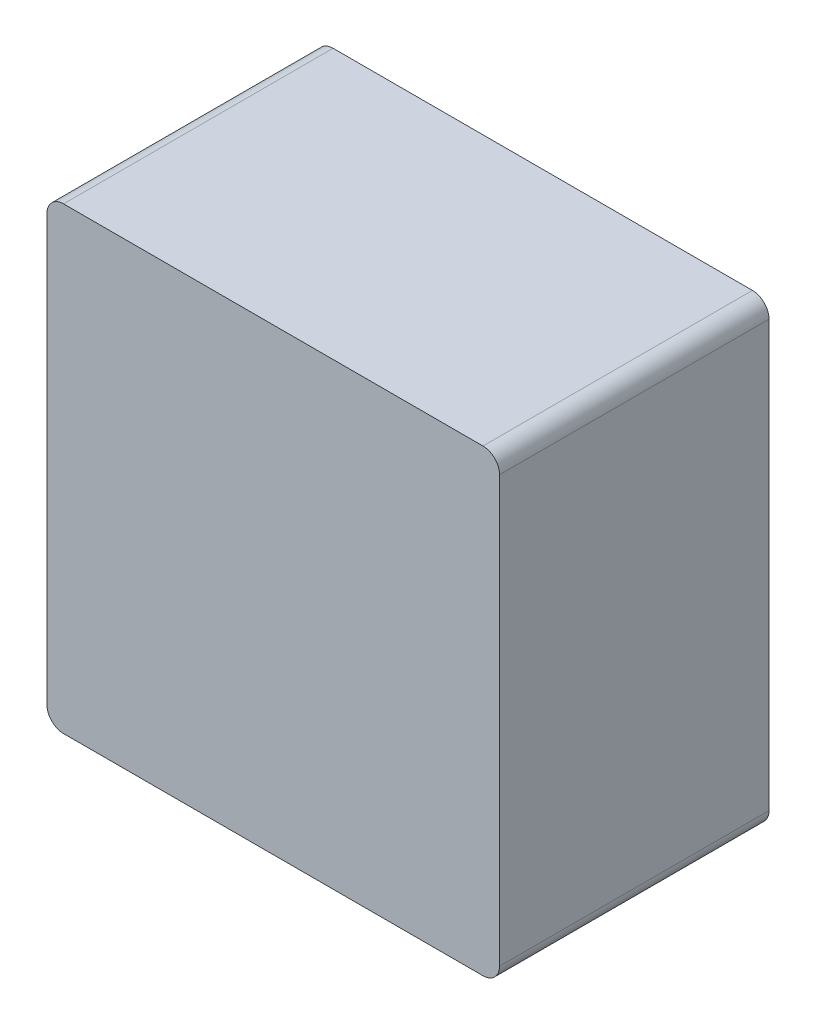
ISO-10303-21;
HEADER;
FILE_DESCRIPTION(('STEP AP214'),'2;1');
FILE_NAME('part.step','',(''),(''),'','','');
FILE_SCHEMA(('AUTOMOTIVE_DESIGN { 1 0 10303 214 1 1 1 1 }'));
ENDSEC;
DATA;
#1=APPLICATION_CONTEXT('core data for automotive mechanical design processes');
#2=APPLICATION_PROTOCOL_DEFINITION('international standard','automotive_design',2000,#1);
#3=PRODUCT_CONTEXT('',#1,'mechanical');
#4=PRODUCT('Part','Part','',(#3));
#5=PRODUCT_RELATED_PRODUCT_CATEGORY('part','',(#4));
#6=PRODUCT_DEFINITION_FORMATION('','',#4);
#7=PRODUCT_DEFINITION_CONTEXT('part definition',#1,'design');
#8=PRODUCT_DEFINITION('design','',#6,#7);
#9=PRODUCT_DEFINITION_SHAPE('','',#8);
#10=(LENGTH_UNIT() NAMED_UNIT(*) SI_UNIT(.MILLI.,.METRE.));
#11=(NAMED_UNIT(*) PLANE_ANGLE_UNIT() SI_UNIT($,.RADIAN.));
#12=(NAMED_UNIT(*) SI_UNIT($,.STERADIAN.) SOLID_ANGLE_UNIT());
#13=UNCERTAINTY_MEASURE_WITH_UNIT(LENGTH_MEASURE(1.E-05),#10,'distance_accuracy_value','');
#14=(GEOMETRIC_REPRESENTATION_CONTEXT(3) GLOBAL_UNCERTAINTY_ASSIGNED_CONTEXT((#13)) GLOBAL_UNIT_ASSIGNED_CONTEXT((#10,
#11,#12)) REPRESENTATION_CONTEXT('',''));
#15=CARTESIAN_POINT('',(0.,0.,0.));
#16=DIRECTION('',(0.,0.,1.));
#17=DIRECTION('',(1.,0.,0.));
#18=AXIS2_PLACEMENT_3D('',#15,#16,#17);
#19=CARTESIAN_POINT('',(0.,0.,80.));
#20=DIRECTION('',(0.,0.,1.));
#21=DIRECTION('',(1.,0.,0.));
#22=AXIS2_PLACEMENT_3D('',#19,#20,#21);
#23=PLANE('',#22);
#24=DIRECTION('',(0.,-1.,0.));
#25=VECTOR('',#24,1.);
#26=CARTESIAN_POINT('',(39.0435,38.599,80.));
#27=LINE('',#26,#25);
#28=CARTESIAN_POINT('',(39.0435,38.599,80.));
#29=VERTEX_POINT('',#28);
#30=CARTESIAN_POINT('',(39.0435,-38.599,80.));
#31=VERTEX_POINT('',#30);
#32=EDGE_CURVE('E179',#29,#31,#27,.T.);
#33=ORIENTED_EDGE('',*,*,#32,.F.);
#34=DIRECTION('',(1.,0.,0.));
#35=VECTOR('',#34,1.);
#36=CARTESIAN_POINT('',(-39.0435,38.599,80.));
#37=LINE('',#36,#35);
#38=CARTESIAN_POINT('',(-39.0435,38.599,80.));
#39=VERTEX_POINT('',#38);
#40=EDGE_CURVE('E53',#39,#29,#37,.T.);
#41=ORIENTED_EDGE('',*,*,#40,.F.);
#42=DIRECTION('',(0.,1.,0.));
#43=VECTOR('',#42,1.);
#44=CARTESIAN_POINT('',(-39.0435,-38.599,80.));
#45=LINE('',#44,#43);
#46=CARTESIAN_POINT('',(-39.0435,-38.599,80.));
#47=VERTEX_POINT('',#46);
#48=EDGE_CURVE('E170',#47,#39,#45,.T.);
#49=ORIENTED_EDGE('',*,*,#48,.F.);
#50=DIRECTION('',(-1.,0.,0.));
#51=VECTOR('',#50,1.);
#52=CARTESIAN_POINT('',(39.0435,-38.599,80.));
#53=LINE('',#52,#51);
#54=EDGE_CURVE('E173',#31,#47,#53,.T.);
#55=ORIENTED_EDGE('',*,*,#54,.F.);
#56=EDGE_LOOP('',(#33,#41,#49,#55));
#57=FACE_BOUND('',#56,.T.);
#58=CARTESIAN_POINT('',(-37.8935,37.449,80.));
#59=DIRECTION('',(0.,0.,1.));
#60=DIRECTION('',(1.,0.,0.));
#61=AXIS2_PLACEMENT_3D('',#58,#59,#60);
#62=CIRCLE('',#61,3.);
#63=CARTESIAN_POINT('',(-40.8935,37.449,80.));
#64=VERTEX_POINT('',#63);
#65=CARTESIAN_POINT('',(-37.8935,40.449,80.));
#66=VERTEX_POINT('',#65);
#67=EDGE_CURVE('E278',#64,#66,#62,.F.);
#68=ORIENTED_EDGE('',*,*,#67,.T.);
#69=DIRECTION('',(-1.,0.,0.));
#70=VECTOR('',#69,1.);
#71=CARTESIAN_POINT('',(-36.8935,40.449,80.));
#72=LINE('',#71,#70);
#73=CARTESIAN_POINT('',(37.8935,40.449,80.));
#74=VERTEX_POINT('',#73);
#75=EDGE_CURVE('E279',#74,#66,#72,.T.);
#76=ORIENTED_EDGE('',*,*,#75,.F.);
#77=CARTESIAN_POINT('',(37.8935,37.449,80.));
#78=DIRECTION('',(0.,0.,1.));
#79=DIRECTION('',(1.,0.,0.));
#80=AXIS2_PLACEMENT_3D('',#77,#78,#79);
#81=CIRCLE('',#80,3.);
#82=CARTESIAN_POINT('',(40.8935,37.449,80.));
#83=VERTEX_POINT('',#82);
#84=EDGE_CURVE('E274',#74,#83,#81,.F.);
#85=ORIENTED_EDGE('',*,*,#84,.T.);
#86=DIRECTION('',(0.,1.,0.));
#87=VECTOR('',#86,1.);
#88=CARTESIAN_POINT('',(40.8935,36.449,80.));
#89=LINE('',#88,#87);
#90=CARTESIAN_POINT('',(40.8935,-39.449,80.));
#91=VERTEX_POINT('',#90);
#92=EDGE_CURVE('E271',#91,#83,#89,.T.);
#93=ORIENTED_EDGE('',*,*,#92,.F.);
#94=CARTESIAN_POINT('',(37.8935,-39.449,80.));
#95=DIRECTION('',(0.,0.,1.));
#96=DIRECTION('',(1.,0.,0.));
#97=AXIS2_PLACEMENT_3D('',#94,#95,#96);
#98=CIRCLE('',#97,3.);
#99=CARTESIAN_POINT('',(37.8935,-42.449,80.));
#100=VERTEX_POINT('',#99);
#101=EDGE_CURVE('E46',#91,#100,#98,.F.);
#102=ORIENTED_EDGE('',*,*,#101,.T.);
#103=DIRECTION('',(-1.,0.,0.));
#104=VECTOR('',#103,1.);
#105=CARTESIAN_POINT('',(0.,-42.449,80.));
#106=LINE('',#105,#104);
#107=CARTESIAN_POINT('',(-37.8935,-42.449,80.));
#108=VERTEX_POINT('',#107);
#109=EDGE_CURVE('E275',#100,#108,#106,.T.);
#110=ORIENTED_EDGE('',*,*,#109,.T.);
#111=CARTESIAN_POINT('',(-37.8935,-39.449,80.));
#112=DIRECTION('',(0.,0.,1.));
#113=DIRECTION('',(1.,0.,0.));
#114=AXIS2_PLACEMENT_3D('',#111,#112,#113);
#115=CIRCLE('',#114,3.);
#116=CARTESIAN_POINT('',(-40.8935,-39.449,80.));
#117=VERTEX_POINT('',#116);
#118=EDGE_CURVE('E284',#108,#117,#115,.F.);
#119=ORIENTED_EDGE('',*,*,#118,.T.);
#120=DIRECTION('',(0.,-1.,0.));
#121=VECTOR('',#120,1.);
#122=CARTESIAN_POINT('',(-40.8935,36.449,80.));
#123=LINE('',#122,#121);
#124=EDGE_CURVE('E281',#64,#117,#123,.T.);
#125=ORIENTED_EDGE('',*,*,#124,.F.);
#126=EDGE_LOOP('',(#68,#76,#85,#93,#102,#110,#119,#125));
#127=FACE_BOUND('',#126,.T.);
#128=ADVANCED_FACE('F39',(#57,#127),#23,.F.);
#129=CARTESIAN_POINT('',(-36.8935,40.449,123.698));
#130=DIRECTION('',(0.,-1.,0.));
#131=DIRECTION('',(0.,0.,-1.));
#132=AXIS2_PLACEMENT_3D('',#129,#130,#131);
#133=PLANE('',#132);
#134=DIRECTION('',(0.,0.,-1.));
#135=VECTOR('',#134,1.);
#136=CARTESIAN_POINT('',(37.8935,40.449,123.698));
#137=LINE('',#136,#135);
#138=CARTESIAN_POINT('',(37.8935,40.449,128.698));
#139=VERTEX_POINT('',#138);
#140=EDGE_CURVE('E248',#139,#74,#137,.T.);
#141=ORIENTED_EDGE('',*,*,#140,.T.);
#142=ORIENTED_EDGE('',*,*,#75,.T.);
#143=DIRECTION('',(0.,0.,-1.));
#144=VECTOR('',#143,1.);
#145=CARTESIAN_POINT('',(-37.8935,40.449,123.698));
#146=LINE('',#145,#144);
#147=CARTESIAN_POINT('',(-37.8935,40.449,128.698));
#148=VERTEX_POINT('',#147);
#149=EDGE_CURVE('E251',#66,#148,#146,.F.);
#150=ORIENTED_EDGE('',*,*,#149,.T.);
#151=DIRECTION('',(-1.,0.,0.));
#152=VECTOR('',#151,1.);
#153=CARTESIAN_POINT('',(40.8935,40.449,128.698));
#154=LINE('',#153,#152);
#155=EDGE_CURVE('E213',#139,#148,#154,.T.);
#156=ORIENTED_EDGE('',*,*,#155,.F.);
#157=EDGE_LOOP('',(#141,#142,#150,#156));
#158=FACE_BOUND('',#157,.T.);
#159=ADVANCED_FACE('F299',(#158),#133,.F.);
#160=CARTESIAN_POINT('',(-40.8935,36.449,123.698));
#161=DIRECTION('',(1.,0.,0.));
#162=DIRECTION('',(0.,1.,0.));
#163=AXIS2_PLACEMENT_3D('',#160,#161,#162);
#164=PLANE('',#163);
#165=DIRECTION('',(0.,0.,-1.));
#166=VECTOR('',#165,1.);
#167=CARTESIAN_POINT('',(-40.8935,37.449,123.698));
#168=LINE('',#167,#166);
#169=CARTESIAN_POINT('',(-40.8935,37.449,128.698));
#170=VERTEX_POINT('',#169);
#171=EDGE_CURVE('E245',#170,#64,#168,.T.);
#172=ORIENTED_EDGE('',*,*,#171,.T.);
#173=ORIENTED_EDGE('',*,*,#124,.T.);
#174=DIRECTION('',(0.,0.,-1.));
#175=VECTOR('',#174,1.);
#176=CARTESIAN_POINT('',(-40.8935,-39.449,128.698));
#177=LINE('',#176,#175);
#178=CARTESIAN_POINT('',(-40.8935,-39.449,128.698));
#179=VERTEX_POINT('',#178);
#180=EDGE_CURVE('E243',#117,#179,#177,.F.);
#181=ORIENTED_EDGE('',*,*,#180,.T.);
#182=DIRECTION('',(0.,-1.,0.));
#183=VECTOR('',#182,1.);
#184=CARTESIAN_POINT('',(-40.8935,40.449,128.698));
#185=LINE('',#184,#183);
#186=EDGE_CURVE('E216',#170,#179,#185,.T.);
#187=ORIENTED_EDGE('',*,*,#186,.F.);
#188=EDGE_LOOP('',(#172,#173,#181,#187));
#189=FACE_BOUND('',#188,.T.);
#190=ADVANCED_FACE('F327',(#189),#164,.F.);
#191=CARTESIAN_POINT('',(40.8935,36.449,123.698));
#192=DIRECTION('',(-1.,0.,0.));
#193=DIRECTION('',(0.,0.,1.));
#194=AXIS2_PLACEMENT_3D('',#191,#192,#193);
#195=PLANE('',#194);
#196=DIRECTION('',(0.,0.,1.));
#197=VECTOR('',#196,1.);
#198=CARTESIAN_POINT('',(40.8935,-39.449,-4.));
#199=LINE('',#198,#197);
#200=CARTESIAN_POINT('',(40.8935,-39.449,128.698));
#201=VERTEX_POINT('',#200);
#202=EDGE_CURVE('E266',#201,#91,#199,.F.);
#203=ORIENTED_EDGE('',*,*,#202,.T.);
#204=ORIENTED_EDGE('',*,*,#92,.T.);
#205=DIRECTION('',(0.,0.,-1.));
#206=VECTOR('',#205,1.);
#207=CARTESIAN_POINT('',(40.8935,37.449,123.698));
#208=LINE('',#207,#206);
#209=CARTESIAN_POINT('',(40.8935,37.449,128.698));
#210=VERTEX_POINT('',#209);
#211=EDGE_CURVE('E269',#83,#210,#208,.F.);
#212=ORIENTED_EDGE('',*,*,#211,.T.);
#213=DIRECTION('',(0.,1.,0.));
#214=VECTOR('',#213,1.);
#215=CARTESIAN_POINT('',(40.8935,-40.449,128.698));
#216=LINE('',#215,#214);
#217=EDGE_CURVE('E210',#201,#210,#216,.T.);
#218=ORIENTED_EDGE('',*,*,#217,.F.);
#219=EDGE_LOOP('',(#203,#204,#212,#218));
#220=FACE_BOUND('',#219,.T.);
#221=ADVANCED_FACE('F313',(#220),#195,.F.);
#222=CARTESIAN_POINT('',(0.,0.,128.698));
#223=DIRECTION('',(0.,0.,1.));
#224=DIRECTION('',(1.,0.,0.));
#225=AXIS2_PLACEMENT_3D('',#222,#223,#224);
#226=PLANE('',#225);
#227=ORIENTED_EDGE('',*,*,#155,.T.);
#228=CARTESIAN_POINT('',(-37.8935,37.449,128.698));
#229=DIRECTION('',(0.,0.,1.));
#230=DIRECTION('',(1.,0.,0.));
#231=AXIS2_PLACEMENT_3D('',#228,#229,#230);
#232=CIRCLE('',#231,3.);
#233=EDGE_CURVE('E259',#148,#170,#232,.T.);
#234=ORIENTED_EDGE('',*,*,#233,.T.);
#235=ORIENTED_EDGE('',*,*,#186,.T.);
#236=CARTESIAN_POINT('',(-37.8935,-39.449,128.698));
#237=DIRECTION('',(0.,0.,1.));
#238=DIRECTION('',(1.,0.,0.));
#239=AXIS2_PLACEMENT_3D('',#236,#237,#238);
#240=CIRCLE('',#239,3.);
#241=CARTESIAN_POINT('',(-37.8935,-42.449,128.698));
#242=VERTEX_POINT('',#241);
#243=EDGE_CURVE('E257',#179,#242,#240,.T.);
#244=ORIENTED_EDGE('',*,*,#243,.T.);
#245=DIRECTION('',(-1.,0.,0.));
#246=VECTOR('',#245,1.);
#247=CARTESIAN_POINT('',(40.8935,-42.449,128.698));
#248=LINE('',#247,#246);
#249=CARTESIAN_POINT('',(37.8935,-42.449,128.698));
#250=VERTEX_POINT('',#249);
#251=EDGE_CURVE('E205',#250,#242,#248,.T.);
#252=ORIENTED_EDGE('',*,*,#251,.F.);
#253=CARTESIAN_POINT('',(37.8935,-39.449,128.698));
#254=DIRECTION('',(0.,0.,1.));
#255=DIRECTION('',(1.,0.,0.));
#256=AXIS2_PLACEMENT_3D('',#253,#254,#255);
#257=CIRCLE('',#256,3.);
#258=EDGE_CURVE('E253',#250,#201,#257,.T.);
#259=ORIENTED_EDGE('',*,*,#258,.T.);
#260=ORIENTED_EDGE('',*,*,#217,.T.);
#261=CARTESIAN_POINT('',(37.8935,37.449,128.698));
#262=DIRECTION('',(0.,0.,1.));
#263=DIRECTION('',(1.,0.,0.));
#264=AXIS2_PLACEMENT_3D('',#261,#262,#263);
#265=CIRCLE('',#264,3.);
#266=EDGE_CURVE('E255',#210,#139,#265,.T.);
#267=ORIENTED_EDGE('',*,*,#266,.T.);
#268=EDGE_LOOP('',(#227,#234,#235,#244,#252,#259,#260,#267));
#269=FACE_BOUND('',#268,.T.);
#270=ADVANCED_FACE('F302',(#269),#226,.T.);
#271=CARTESIAN_POINT('',(0.,-42.449,0.));
#272=DIRECTION('',(0.,-1.,0.));
#273=DIRECTION('',(1.,0.,0.));
#274=AXIS2_PLACEMENT_3D('',#271,#272,#273);
#275=PLANE('',#274);
#276=ORIENTED_EDGE('',*,*,#109,.F.);
#277=DIRECTION('',(0.,0.,1.));
#278=VECTOR('',#277,1.);
#279=CARTESIAN_POINT('',(37.8935,-42.449,128.698));
#280=LINE('',#279,#278);
#281=EDGE_CURVE('E261',#100,#250,#280,.T.);
#282=ORIENTED_EDGE('',*,*,#281,.T.);
#283=ORIENTED_EDGE('',*,*,#251,.T.);
#284=DIRECTION('',(0.,0.,-1.));
#285=VECTOR('',#284,1.);
#286=CARTESIAN_POINT('',(-37.8935,-42.449,-4.));
#287=LINE('',#286,#285);
#288=EDGE_CURVE('E263',#242,#108,#287,.T.);
#289=ORIENTED_EDGE('',*,*,#288,.T.);
#290=EDGE_LOOP('',(#276,#282,#283,#289));
#291=FACE_BOUND('',#290,.T.);
#292=CARTESIAN_POINT('',(22.225,-42.449,109.648));
#293=DIRECTION('',(0.,-1.,0.));
#294=DIRECTION('',(1.,0.,0.));
#295=AXIS2_PLACEMENT_3D('',#292,#293,#294);
#296=CIRCLE('',#295,3.025);
#297=CARTESIAN_POINT('',(25.25,-42.449,109.648));
#298=VERTEX_POINT('',#297);
#299=EDGE_CURVE('E196',#298,#298,#296,.T.);
#300=ORIENTED_EDGE('',*,*,#299,.F.);
#301=EDGE_LOOP('',(#300));
#302=FACE_BOUND('',#301,.T.);
#303=CARTESIAN_POINT('',(-22.225,-42.449,109.648));
#304=DIRECTION('',(0.,-1.,0.));
#305=DIRECTION('',(1.,0.,0.));
#306=AXIS2_PLACEMENT_3D('',#303,#304,#305);
#307=CIRCLE('',#306,3.025);
#308=CARTESIAN_POINT('',(-19.2,-42.449,109.648));
#309=VERTEX_POINT('',#308);
#310=EDGE_CURVE('E199',#309,#309,#307,.T.);
#311=ORIENTED_EDGE('',*,*,#310,.F.);
#312=EDGE_LOOP('',(#311));
#313=FACE_BOUND('',#312,.T.);
#314=ADVANCED_FACE('F319',(#291,#302,#313),#275,.T.);
#315=CARTESIAN_POINT('',(-22.225,-37.449,109.648));
#316=DIRECTION('',(0.,-1.,0.));
#317=DIRECTION('',(1.,0.,0.));
#318=AXIS2_PLACEMENT_3D('',#315,#316,#317);
#319=CYLINDRICAL_SURFACE('',#318,3.025);
#320=CARTESIAN_POINT('',(-22.225,-37.449,109.648));
#321=DIRECTION('',(0.,-1.,0.));
#322=DIRECTION('',(1.,0.,0.));
#323=AXIS2_PLACEMENT_3D('',#320,#321,#322);
#324=CIRCLE('',#323,3.025);
#325=CARTESIAN_POINT('',(-19.2,-37.449,109.648));
#326=VERTEX_POINT('',#325);
#327=EDGE_CURVE('E202',#326,#326,#324,.T.);
#328=ORIENTED_EDGE('',*,*,#327,.F.);
#329=EDGE_LOOP('',(#328));
#330=FACE_BOUND('',#329,.T.);
#331=ORIENTED_EDGE('',*,*,#310,.T.);
#332=EDGE_LOOP('',(#331));
#333=FACE_BOUND('',#332,.T.);
#334=ADVANCED_FACE('F375',(#330,#333),#319,.F.);
#335=CARTESIAN_POINT('',(-22.225,-37.449,109.648));
#336=DIRECTION('',(0.,-1.,0.));
#337=DIRECTION('',(1.,0.,0.));
#338=AXIS2_PLACEMENT_3D('',#335,#336,#337);
#339=PLANE('',#338);
#340=ORIENTED_EDGE('',*,*,#327,.T.);
#341=EDGE_LOOP('',(#340));
#342=FACE_BOUND('',#341,.T.);
#343=ADVANCED_FACE('F369',(#342),#339,.T.);
#344=CARTESIAN_POINT('',(22.225,-37.449,109.648));
#345=DIRECTION('',(0.,-1.,0.));
#346=DIRECTION('',(1.,0.,0.));
#347=AXIS2_PLACEMENT_3D('',#344,#345,#346);
#348=CYLINDRICAL_SURFACE('',#347,3.025);
#349=CARTESIAN_POINT('',(22.225,-37.449,109.648));
#350=DIRECTION('',(0.,-1.,0.));
#351=DIRECTION('',(1.,0.,0.));
#352=AXIS2_PLACEMENT_3D('',#349,#350,#351);
#353=CIRCLE('',#352,3.025);
#354=CARTESIAN_POINT('',(25.25,-37.449,109.648));
#355=VERTEX_POINT('',#354);
#356=EDGE_CURVE('E195',#355,#355,#353,.T.);
#357=ORIENTED_EDGE('',*,*,#356,.F.);
#358=EDGE_LOOP('',(#357));
#359=FACE_BOUND('',#358,.T.);
#360=ORIENTED_EDGE('',*,*,#299,.T.);
#361=EDGE_LOOP('',(#360));
#362=FACE_BOUND('',#361,.T.);
#363=ADVANCED_FACE('F362',(#359,#362),#348,.F.);
#364=CARTESIAN_POINT('',(22.225,-37.449,109.648));
#365=DIRECTION('',(0.,-1.,0.));
#366=DIRECTION('',(1.,0.,0.));
#367=AXIS2_PLACEMENT_3D('',#364,#365,#366);
#368=PLANE('',#367);
#369=ORIENTED_EDGE('',*,*,#356,.T.);
#370=EDGE_LOOP('',(#369));
#371=FACE_BOUND('',#370,.T.);
#372=ADVANCED_FACE('F357',(#371),#368,.T.);
#373=CARTESIAN_POINT('',(-37.8935,37.449,123.698));
#374=DIRECTION('',(0.,0.,-1.));
#375=DIRECTION('',(-1.,0.,0.));
#376=AXIS2_PLACEMENT_3D('',#373,#374,#375);
#377=CYLINDRICAL_SURFACE('',#376,3.);
#378=ORIENTED_EDGE('',*,*,#67,.F.);
#379=ORIENTED_EDGE('',*,*,#171,.F.);
#380=ORIENTED_EDGE('',*,*,#233,.F.);
#381=ORIENTED_EDGE('',*,*,#149,.F.);
#382=EDGE_LOOP('',(#378,#379,#380,#381));
#383=FACE_BOUND('',#382,.T.);
#384=ADVANCED_FACE('F296',(#383),#377,.T.);
#385=CARTESIAN_POINT('',(-37.8935,-39.449,0.));
#386=DIRECTION('',(0.,0.,1.));
#387=DIRECTION('',(1.,0.,0.));
#388=AXIS2_PLACEMENT_3D('',#385,#386,#387);
#389=CYLINDRICAL_SURFACE('',#388,3.);
#390=ORIENTED_EDGE('',*,*,#118,.F.);
#391=ORIENTED_EDGE('',*,*,#288,.F.);
#392=ORIENTED_EDGE('',*,*,#243,.F.);
#393=ORIENTED_EDGE('',*,*,#180,.F.);
#394=EDGE_LOOP('',(#390,#391,#392,#393));
#395=FACE_BOUND('',#394,.T.);
#396=ADVANCED_FACE('F325',(#395),#389,.T.);
#397=CARTESIAN_POINT('',(37.8935,37.449,123.698));
#398=DIRECTION('',(0.,0.,-1.));
#399=DIRECTION('',(-1.,0.,0.));
#400=AXIS2_PLACEMENT_3D('',#397,#398,#399);
#401=CYLINDRICAL_SURFACE('',#400,3.);
#402=ORIENTED_EDGE('',*,*,#84,.F.);
#403=ORIENTED_EDGE('',*,*,#140,.F.);
#404=ORIENTED_EDGE('',*,*,#266,.F.);
#405=ORIENTED_EDGE('',*,*,#211,.F.);
#406=EDGE_LOOP('',(#402,#403,#404,#405));
#407=FACE_BOUND('',#406,.T.);
#408=ADVANCED_FACE('F308',(#407),#401,.T.);
#409=CARTESIAN_POINT('',(37.8935,-39.449,0.));
#410=DIRECTION('',(0.,0.,-1.));
#411=DIRECTION('',(-1.,0.,0.));
#412=AXIS2_PLACEMENT_3D('',#409,#410,#411);
#413=CYLINDRICAL_SURFACE('',#412,3.);
#414=ORIENTED_EDGE('',*,*,#101,.F.);
#415=ORIENTED_EDGE('',*,*,#202,.F.);
#416=ORIENTED_EDGE('',*,*,#258,.F.);
#417=ORIENTED_EDGE('',*,*,#281,.F.);
#418=EDGE_LOOP('',(#414,#415,#416,#417));
#419=FACE_BOUND('',#418,.T.);
#420=ADVANCED_FACE('F316',(#419),#413,.T.);
#421=CARTESIAN_POINT('',(-39.0435,38.599,101.));
#422=DIRECTION('',(0.,1.,0.));
#423=DIRECTION('',(-1.,0.,0.));
#424=AXIS2_PLACEMENT_3D('',#421,#422,#423);
#425=PLANE('',#424);
#426=ORIENTED_EDGE('',*,*,#40,.T.);
#427=DIRECTION('',(0.,0.,-1.));
#428=VECTOR('',#427,1.);
#429=CARTESIAN_POINT('',(39.0435,38.599,101.));
#430=LINE('',#429,#428);
#431=CARTESIAN_POINT('',(39.0435,38.599,101.));
#432=VERTEX_POINT('',#431);
#433=EDGE_CURVE('E148',#432,#29,#430,.T.);
#434=ORIENTED_EDGE('',*,*,#433,.F.);
#435=DIRECTION('',(1.,0.,0.));
#436=VECTOR('',#435,1.);
#437=CARTESIAN_POINT('',(-39.0435,38.599,101.));
#438=LINE('',#437,#436);
#439=CARTESIAN_POINT('',(-39.0435,38.599,101.));
#440=VERTEX_POINT('',#439);
#441=EDGE_CURVE('E152',#440,#432,#438,.T.);
#442=ORIENTED_EDGE('',*,*,#441,.F.);
#443=DIRECTION('',(0.,0.,-1.));
#444=VECTOR('',#443,1.);
#445=CARTESIAN_POINT('',(-39.0435,38.599,101.));
#446=LINE('',#445,#444);
#447=EDGE_CURVE('E183',#440,#39,#446,.T.);
#448=ORIENTED_EDGE('',*,*,#447,.T.);
#449=EDGE_LOOP('',(#426,#434,#442,#448));
#450=FACE_BOUND('',#449,.T.);
#451=ADVANCED_FACE('F150',(#450),#425,.F.);
#452=CARTESIAN_POINT('',(-39.0435,-38.599,101.));
#453=DIRECTION('',(-1.,0.,0.));
#454=DIRECTION('',(0.,0.,1.));
#455=AXIS2_PLACEMENT_3D('',#452,#453,#454);
#456=PLANE('',#455);
#457=ORIENTED_EDGE('',*,*,#48,.T.);
#458=ORIENTED_EDGE('',*,*,#447,.F.);
#459=DIRECTION('',(0.,1.,0.));
#460=VECTOR('',#459,1.);
#461=CARTESIAN_POINT('',(-39.0435,-38.599,101.));
#462=LINE('',#461,#460);
#463=CARTESIAN_POINT('',(-39.0435,-38.599,101.));
#464=VERTEX_POINT('',#463);
#465=EDGE_CURVE('E158',#464,#440,#462,.T.);
#466=ORIENTED_EDGE('',*,*,#465,.F.);
#467=DIRECTION('',(0.,0.,-1.));
#468=VECTOR('',#467,1.);
#469=CARTESIAN_POINT('',(-39.0435,-38.599,101.));
#470=LINE('',#469,#468);
#471=EDGE_CURVE('E185',#464,#47,#470,.T.);
#472=ORIENTED_EDGE('',*,*,#471,.T.);
#473=EDGE_LOOP('',(#457,#458,#466,#472));
#474=FACE_BOUND('',#473,.T.);
#475=ADVANCED_FACE('F350',(#474),#456,.F.);
#476=CARTESIAN_POINT('',(39.0435,-38.599,101.));
#477=DIRECTION('',(0.,-1.,0.));
#478=DIRECTION('',(1.,0.,0.));
#479=AXIS2_PLACEMENT_3D('',#476,#477,#478);
#480=PLANE('',#479);
#481=ORIENTED_EDGE('',*,*,#54,.T.);
#482=ORIENTED_EDGE('',*,*,#471,.F.);
#483=DIRECTION('',(-1.,0.,0.));
#484=VECTOR('',#483,1.);
#485=CARTESIAN_POINT('',(39.0435,-38.599,101.));
#486=LINE('',#485,#484);
#487=CARTESIAN_POINT('',(39.0435,-38.599,101.));
#488=VERTEX_POINT('',#487);
#489=EDGE_CURVE('E166',#488,#464,#486,.T.);
#490=ORIENTED_EDGE('',*,*,#489,.F.);
#491=DIRECTION('',(0.,0.,-1.));
#492=VECTOR('',#491,1.);
#493=CARTESIAN_POINT('',(39.0435,-38.599,101.));
#494=LINE('',#493,#492);
#495=EDGE_CURVE('E157',#488,#31,#494,.T.);
#496=ORIENTED_EDGE('',*,*,#495,.T.);
#497=EDGE_LOOP('',(#481,#482,#490,#496));
#498=FACE_BOUND('',#497,.T.);
#499=ADVANCED_FACE('F417',(#498),#480,.F.);
#500=CARTESIAN_POINT('',(39.0435,38.599,101.));
#501=DIRECTION('',(1.,0.,0.));
#502=DIRECTION('',(0.,1.,0.));
#503=AXIS2_PLACEMENT_3D('',#500,#501,#502);
#504=PLANE('',#503);
#505=ORIENTED_EDGE('',*,*,#32,.T.);
#506=ORIENTED_EDGE('',*,*,#495,.F.);
#507=DIRECTION('',(0.,-1.,0.));
#508=VECTOR('',#507,1.);
#509=CARTESIAN_POINT('',(39.0435,38.599,101.));
#510=LINE('',#509,#508);
#511=EDGE_CURVE('E161',#432,#488,#510,.T.);
#512=ORIENTED_EDGE('',*,*,#511,.F.);
#513=ORIENTED_EDGE('',*,*,#433,.T.);
#514=EDGE_LOOP('',(#505,#506,#512,#513));
#515=FACE_BOUND('',#514,.T.);
#516=ADVANCED_FACE('F162',(#515),#504,.F.);
#517=CARTESIAN_POINT('',(0.,0.,101.));
#518=DIRECTION('',(0.,0.,-1.));
#519=DIRECTION('',(-1.,0.,0.));
#520=AXIS2_PLACEMENT_3D('',#517,#518,#519);
#521=PLANE('',#520);
#522=DIRECTION('',(-1.,0.,0.));
#523=VECTOR('',#522,1.);
#524=CARTESIAN_POINT('',(-36.8935,-36.449,101.));
#525=LINE('',#524,#523);
#526=CARTESIAN_POINT('',(36.8935,-36.449,101.));
#527=VERTEX_POINT('',#526);
#528=CARTESIAN_POINT('',(-36.8935,-36.449,101.));
#529=VERTEX_POINT('',#528);
#530=EDGE_CURVE('E189',#527,#529,#525,.T.);
#531=ORIENTED_EDGE('',*,*,#530,.F.);
#532=DIRECTION('',(0.,-1.,0.));
#533=VECTOR('',#532,1.);
#534=CARTESIAN_POINT('',(36.8935,36.449,101.));
#535=LINE('',#534,#533);
#536=CARTESIAN_POINT('',(36.8935,36.449,101.));
#537=VERTEX_POINT('',#536);
#538=EDGE_CURVE('E61',#537,#527,#535,.T.);
#539=ORIENTED_EDGE('',*,*,#538,.F.);
#540=DIRECTION('',(1.,0.,0.));
#541=VECTOR('',#540,1.);
#542=CARTESIAN_POINT('',(-36.8935,36.449,101.));
#543=LINE('',#542,#541);
#544=CARTESIAN_POINT('',(-36.8935,36.449,101.));
#545=VERTEX_POINT('',#544);
#546=EDGE_CURVE('E11',#545,#537,#543,.T.);
#547=ORIENTED_EDGE('',*,*,#546,.F.);
#548=DIRECTION('',(0.,1.,0.));
#549=VECTOR('',#548,1.);
#550=CARTESIAN_POINT('',(-36.8935,36.449,101.));
#551=LINE('',#550,#549);
#552=EDGE_CURVE('E192',#529,#545,#551,.T.);
#553=ORIENTED_EDGE('',*,*,#552,.F.);
#554=EDGE_LOOP('',(#531,#539,#547,#553));
#555=FACE_BOUND('',#554,.T.);
#556=ORIENTED_EDGE('',*,*,#441,.T.);
#557=ORIENTED_EDGE('',*,*,#511,.T.);
#558=ORIENTED_EDGE('',*,*,#489,.T.);
#559=ORIENTED_EDGE('',*,*,#465,.T.);
#560=EDGE_LOOP('',(#556,#557,#558,#559));
#561=FACE_BOUND('',#560,.T.);
#562=ADVANCED_FACE('F168',(#555,#561),#521,.T.);
#563=CARTESIAN_POINT('',(0.,0.,124.698));
#564=DIRECTION('',(0.,0.,1.));
#565=DIRECTION('',(1.,0.,0.));
#566=AXIS2_PLACEMENT_3D('',#563,#564,#565);
#567=PLANE('',#566);
#568=DIRECTION('',(-1.,0.,0.));
#569=VECTOR('',#568,1.);
#570=CARTESIAN_POINT('',(36.8935,36.449,124.698));
#571=LINE('',#570,#569);
#572=CARTESIAN_POINT('',(36.8935,36.449,124.698));
#573=VERTEX_POINT('',#572);
#574=CARTESIAN_POINT('',(-36.8935,36.449,124.698));
#575=VERTEX_POINT('',#574);
#576=EDGE_CURVE('E222',#573,#575,#571,.T.);
#577=ORIENTED_EDGE('',*,*,#576,.F.);
#578=DIRECTION('',(0.,1.,0.));
#579=VECTOR('',#578,1.);
#580=CARTESIAN_POINT('',(36.8935,-36.449,124.698));
#581=LINE('',#580,#579);
#582=CARTESIAN_POINT('',(36.8935,-36.449,124.698));
#583=VERTEX_POINT('',#582);
#584=EDGE_CURVE('E219',#583,#573,#581,.T.);
#585=ORIENTED_EDGE('',*,*,#584,.F.);
#586=DIRECTION('',(1.,0.,0.));
#587=VECTOR('',#586,1.);
#588=CARTESIAN_POINT('',(-36.8935,-36.449,124.698));
#589=LINE('',#588,#587);
#590=CARTESIAN_POINT('',(-36.8935,-36.449,124.698));
#591=VERTEX_POINT('',#590);
#592=EDGE_CURVE('E228',#591,#583,#589,.T.);
#593=ORIENTED_EDGE('',*,*,#592,.F.);
#594=DIRECTION('',(0.,-1.,0.));
#595=VECTOR('',#594,1.);
#596=CARTESIAN_POINT('',(-36.8935,36.449,124.698));
#597=LINE('',#596,#595);
#598=EDGE_CURVE('E225',#575,#591,#597,.T.);
#599=ORIENTED_EDGE('',*,*,#598,.F.);
#600=EDGE_LOOP('',(#577,#585,#593,#599));
#601=FACE_BOUND('',#600,.T.);
#602=ADVANCED_FACE('F384',(#601),#567,.F.);
#603=CARTESIAN_POINT('',(-36.8935,36.449,123.698));
#604=DIRECTION('',(0.,-1.,0.));
#605=DIRECTION('',(0.,0.,-1.));
#606=AXIS2_PLACEMENT_3D('',#603,#604,#605);
#607=PLANE('',#606);
#608=DIRECTION('',(0.,0.,-1.));
#609=VECTOR('',#608,1.);
#610=CARTESIAN_POINT('',(-36.8935,36.449,123.698));
#611=LINE('',#610,#609);
#612=EDGE_CURVE('E240',#575,#545,#611,.T.);
#613=ORIENTED_EDGE('',*,*,#612,.T.);
#614=ORIENTED_EDGE('',*,*,#546,.T.);
#615=DIRECTION('',(0.,0.,-1.));
#616=VECTOR('',#615,1.);
#617=CARTESIAN_POINT('',(36.8935,36.449,123.698));
#618=LINE('',#617,#616);
#619=EDGE_CURVE('E231',#573,#537,#618,.T.);
#620=ORIENTED_EDGE('',*,*,#619,.F.);
#621=ORIENTED_EDGE('',*,*,#576,.T.);
#622=EDGE_LOOP('',(#613,#614,#620,#621));
#623=FACE_BOUND('',#622,.T.);
#624=ADVANCED_FACE('F387',(#623),#607,.T.);
#625=CARTESIAN_POINT('',(36.8935,36.449,123.698));
#626=DIRECTION('',(-1.,0.,0.));
#627=DIRECTION('',(0.,0.,1.));
#628=AXIS2_PLACEMENT_3D('',#625,#626,#627);
#629=PLANE('',#628);
#630=ORIENTED_EDGE('',*,*,#619,.T.);
#631=ORIENTED_EDGE('',*,*,#538,.T.);
#632=DIRECTION('',(0.,0.,-1.));
#633=VECTOR('',#632,1.);
#634=CARTESIAN_POINT('',(36.8935,-36.449,123.698));
#635=LINE('',#634,#633);
#636=EDGE_CURVE('E234',#583,#527,#635,.T.);
#637=ORIENTED_EDGE('',*,*,#636,.F.);
#638=ORIENTED_EDGE('',*,*,#584,.T.);
#639=EDGE_LOOP('',(#630,#631,#637,#638));
#640=FACE_BOUND('',#639,.T.);
#641=ADVANCED_FACE('F389',(#640),#629,.T.);
#642=CARTESIAN_POINT('',(-36.8935,-36.449,123.698));
#643=DIRECTION('',(0.,1.,0.));
#644=DIRECTION('',(-1.,0.,0.));
#645=AXIS2_PLACEMENT_3D('',#642,#643,#644);
#646=PLANE('',#645);
#647=ORIENTED_EDGE('',*,*,#636,.T.);
#648=ORIENTED_EDGE('',*,*,#530,.T.);
#649=DIRECTION('',(0.,0.,-1.));
#650=VECTOR('',#649,1.);
#651=CARTESIAN_POINT('',(-36.8935,-36.449,123.698));
#652=LINE('',#651,#650);
#653=EDGE_CURVE('E237',#591,#529,#652,.T.);
#654=ORIENTED_EDGE('',*,*,#653,.F.);
#655=ORIENTED_EDGE('',*,*,#592,.T.);
#656=EDGE_LOOP('',(#647,#648,#654,#655));
#657=FACE_BOUND('',#656,.T.);
#658=ADVANCED_FACE('F392',(#657),#646,.T.);
#659=CARTESIAN_POINT('',(-36.8935,36.449,123.698));
#660=DIRECTION('',(1.,0.,0.));
#661=DIRECTION('',(0.,1.,0.));
#662=AXIS2_PLACEMENT_3D('',#659,#660,#661);
#663=PLANE('',#662);
#664=ORIENTED_EDGE('',*,*,#653,.T.);
#665=ORIENTED_EDGE('',*,*,#552,.T.);
#666=ORIENTED_EDGE('',*,*,#612,.F.);
#667=ORIENTED_EDGE('',*,*,#598,.T.);
#668=EDGE_LOOP('',(#664,#665,#666,#667));
#669=FACE_BOUND('',#668,.T.);
#670=ADVANCED_FACE('F396',(#669),#663,.T.);
#671=CLOSED_SHELL('',(#128,#159,#190,#221,#270,#314,#334,#343,#363,#372,#384,#396,#408,#420,
#451,#475,#499,#516,#562,#602,#624,#641,#658,#670));
#672=MANIFOLD_SOLID_BREP('B2',#671);
#673=ADVANCED_BREP_SHAPE_REPRESENTATION('',(#18,#672),#14);
#674=SHAPE_DEFINITION_REPRESENTATION(#9,#673);
ENDSEC;
END-ISO-10303-21;
